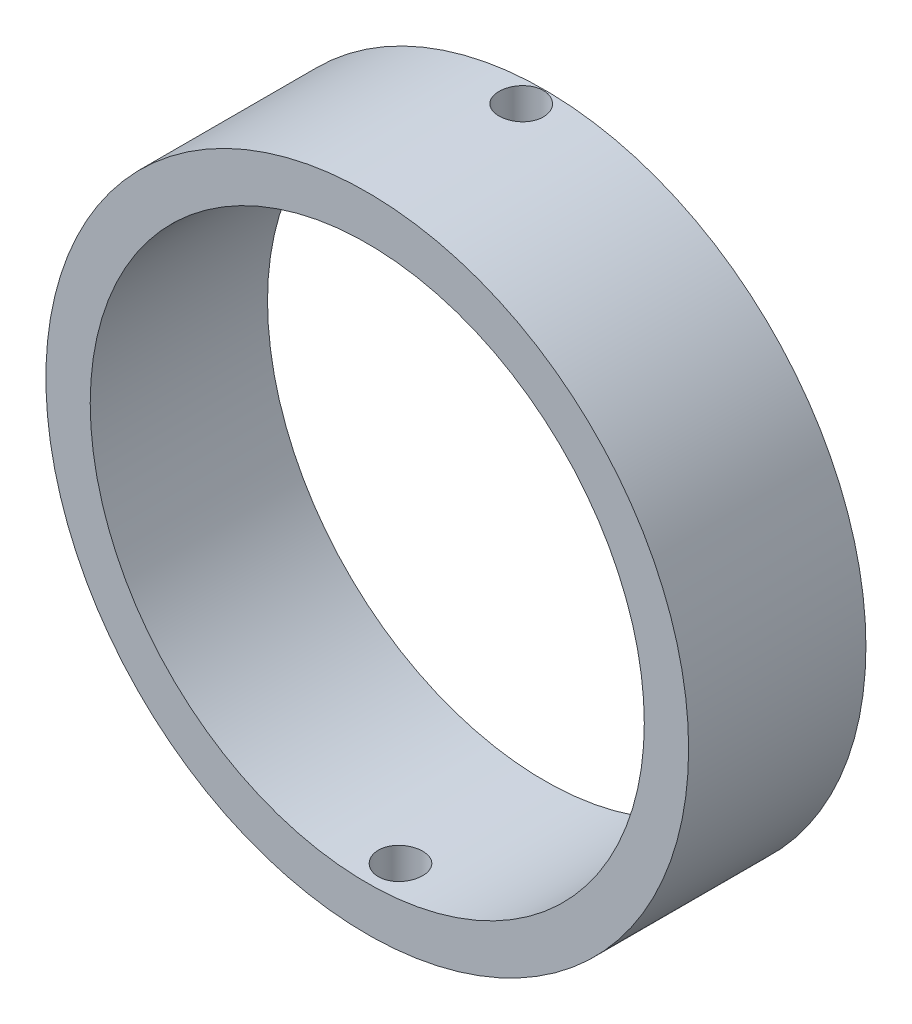
ISO-10303-21;
HEADER;
FILE_DESCRIPTION(('STEP AP214'),'2;1');
FILE_NAME('part.step','',(''),(''),'','','');
FILE_SCHEMA(('AUTOMOTIVE_DESIGN { 1 0 10303 214 1 1 1 1 }'));
ENDSEC;
DATA;
#1=APPLICATION_CONTEXT('core data for automotive mechanical design processes');
#2=APPLICATION_PROTOCOL_DEFINITION('international standard','automotive_design',2000,#1);
#3=PRODUCT_CONTEXT('',#1,'mechanical');
#4=PRODUCT('Part','Part','',(#3));
#5=PRODUCT_RELATED_PRODUCT_CATEGORY('part','',(#4));
#6=PRODUCT_DEFINITION_FORMATION('','',#4);
#7=PRODUCT_DEFINITION_CONTEXT('part definition',#1,'design');
#8=PRODUCT_DEFINITION('design','',#6,#7);
#9=PRODUCT_DEFINITION_SHAPE('','',#8);
#10=(LENGTH_UNIT() NAMED_UNIT(*) SI_UNIT(.MILLI.,.METRE.));
#11=(NAMED_UNIT(*) PLANE_ANGLE_UNIT() SI_UNIT($,.RADIAN.));
#12=(NAMED_UNIT(*) SI_UNIT($,.STERADIAN.) SOLID_ANGLE_UNIT());
#13=UNCERTAINTY_MEASURE_WITH_UNIT(LENGTH_MEASURE(1.E-05),#10,'distance_accuracy_value','');
#14=(GEOMETRIC_REPRESENTATION_CONTEXT(3) GLOBAL_UNCERTAINTY_ASSIGNED_CONTEXT((#13)) GLOBAL_UNIT_ASSIGNED_CONTEXT((#10,
#11,#12)) REPRESENTATION_CONTEXT('',''));
#15=CARTESIAN_POINT('',(0.,0.,0.));
#16=DIRECTION('',(0.,0.,1.));
#17=DIRECTION('',(1.,0.,0.));
#18=AXIS2_PLACEMENT_3D('',#15,#16,#17);
#19=CARTESIAN_POINT('',(0.,0.,16.));
#20=DIRECTION('',(0.,0.,-1.));
#21=DIRECTION('',(-1.,0.,0.));
#22=AXIS2_PLACEMENT_3D('',#19,#20,#21);
#23=CYLINDRICAL_SURFACE('',#22,29.);
#24=CARTESIAN_POINT('',(0.,29.,4.10891279559255));
#25=CARTESIAN_POINT('',(-0.11219781951482,28.9999990868251,4.10890786846932));
#26=CARTESIAN_POINT('',(-0.22447358977125,28.9993419212065,4.09943979792541));
#27=CARTESIAN_POINT('',(-0.445923190959033,28.9967835376471,4.06180666910525));
#28=CARTESIAN_POINT('',(-0.55509328626596,28.9948808825545,4.03362001118363));
#29=CARTESIAN_POINT('',(-0.767091894513714,28.9900466965074,3.95936469679368));
#30=CARTESIAN_POINT('',(-0.869923786418615,28.9871157194385,3.91330566552079));
#31=CARTESIAN_POINT('',(-1.0663705098148,28.980554273346,3.80462912367283));
#32=CARTESIAN_POINT('',(-1.15998740659419,28.9769239616008,3.74201533504087));
#33=CARTESIAN_POINT('',(-1.33554073444891,28.969364438608,3.60188436379909));
#34=CARTESIAN_POINT('',(-1.41745843221283,28.9654347630945,3.5243437355337));
#35=CARTESIAN_POINT('',(-1.56712762225839,28.9577233526317,3.35660898057448));
#36=CARTESIAN_POINT('',(-1.6348785143176,28.953941623956,3.26641431802208));
#37=CARTESIAN_POINT('',(-1.7543507491539,28.9469489134988,3.07582295908316));
#38=CARTESIAN_POINT('',(-1.80605619479745,28.943738499085,2.97541627497255));
#39=CARTESIAN_POINT('',(-1.89186816043847,28.9382565898698,2.76732094085253));
#40=CARTESIAN_POINT('',(-1.92597490355253,28.935985083165,2.65963238318238));
#41=CARTESIAN_POINT('',(-1.97556842395801,28.9326416470759,2.4402134437421));
#42=CARTESIAN_POINT('',(-1.99108499910848,28.931567798178,2.32848982666775));
#43=CARTESIAN_POINT('',(-2.00314973173091,28.9307350330865,2.1040190544217));
#44=CARTESIAN_POINT('',(-1.99969814346407,28.930976099267,1.9912719129902));
#45=CARTESIAN_POINT('',(-1.97394922086929,28.9327441979778,1.76815793218316));
#46=CARTESIAN_POINT('',(-1.95168416934708,28.9342690276286,1.65778734725841));
#47=CARTESIAN_POINT('',(-1.88899043997421,28.9384293591186,1.44235378697192));
#48=CARTESIAN_POINT('',(-1.84856163400784,28.9410648687918,1.33729084905281));
#49=CARTESIAN_POINT('',(-1.75065151248554,28.9471521076119,1.13535144642691));
#50=CARTESIAN_POINT('',(-1.69315559744967,28.9506045350483,1.03848208216548));
#51=CARTESIAN_POINT('',(-1.56275391723186,28.9579358820925,0.855757222217121));
#52=CARTESIAN_POINT('',(-1.48984793989615,28.9618148075716,0.769901878188803));
#53=CARTESIAN_POINT('',(-1.33051405834731,28.9695718335481,0.61145438425475));
#54=CARTESIAN_POINT('',(-1.24405822390941,28.9734499153934,0.538890316935819));
#55=CARTESIAN_POINT('',(-1.06017657185294,28.9807604753281,0.409301960558244));
#56=CARTESIAN_POINT('',(-0.962750749567816,28.9841929532279,0.352277678110124));
#57=CARTESIAN_POINT('',(-0.759677306657611,28.9902259018983,0.255389801419838));
#58=CARTESIAN_POINT('',(-0.654029152807338,28.9928263186529,0.215527321231924));
#59=CARTESIAN_POINT('',(-0.437517831418851,28.9969014370709,0.154113609462144));
#60=CARTESIAN_POINT('',(-0.326654738036638,28.9983761547365,0.13256211758259));
#61=CARTESIAN_POINT('',(-0.103104119226373,29.0000316457282,0.108417062507951));
#62=CARTESIAN_POINT('',(0.0095791950060323,29.0002150683856,0.105784683014217));
#63=CARTESIAN_POINT('',(0.233785705770457,28.9992743563079,0.119451081370278));
#64=CARTESIAN_POINT('',(0.34530890966944,28.9981502298812,0.135749738929566));
#65=CARTESIAN_POINT('',(0.563919746249213,28.9947226360886,0.186783403350138));
#66=CARTESIAN_POINT('',(0.671011567740033,28.9924203112876,0.221500549966667));
#67=CARTESIAN_POINT('',(0.877849115682946,28.9868952295703,0.308367532873969));
#68=CARTESIAN_POINT('',(0.977594761858643,28.9836724625977,0.360517559630579));
#69=CARTESIAN_POINT('',(1.16708599258944,28.9766617715051,0.480868413474268));
#70=CARTESIAN_POINT('',(1.25681511487271,28.972872940267,0.549095106610017));
#71=CARTESIAN_POINT('',(1.42356036874468,28.9651593638688,0.699625018811105));
#72=CARTESIAN_POINT('',(1.50057634856699,28.9612346170869,0.781928405896701));
#73=CARTESIAN_POINT('',(1.63984107272208,28.9536838278527,0.958443158418399));
#74=CARTESIAN_POINT('',(1.70206459321758,28.9500583024009,1.05267444983183));
#75=CARTESIAN_POINT('',(1.80980545132305,28.9435231104356,1.25027025987213));
#76=CARTESIAN_POINT('',(1.85532291003662,28.9406134387329,1.35363471228523));
#77=CARTESIAN_POINT('',(1.92831608887044,28.935841842411,1.56647136533227));
#78=CARTESIAN_POINT('',(1.95580756267055,28.9339790031243,1.67593814184513));
#79=CARTESIAN_POINT('',(1.99201979649604,28.9315086312462,1.89794712429031));
#80=CARTESIAN_POINT('',(2.00074079128119,28.930901082955,2.0104892917413));
#81=CARTESIAN_POINT('',(1.99916214064585,28.931010193268,2.23520365005236));
#82=CARTESIAN_POINT('',(1.9889021422839,28.9317240916666,2.34737612292635));
#83=CARTESIAN_POINT('',(1.94973508321187,28.9343897991386,2.56840133331779));
#84=CARTESIAN_POINT('',(1.92082798999882,28.9363416103697,2.6772540650484));
#85=CARTESIAN_POINT('',(1.84519658474373,28.9412625116291,2.88855479844702));
#86=CARTESIAN_POINT('',(1.79847260795681,28.9442315825158,2.99100292058648));
#87=CARTESIAN_POINT('',(1.68853880713927,28.9508524178736,3.18660617675232));
#88=CARTESIAN_POINT('',(1.62532936278373,28.9545041666215,3.27976152473131));
#89=CARTESIAN_POINT('',(1.48407119020408,28.9620878270818,3.4543367567487));
#90=CARTESIAN_POINT('',(1.40599350805653,28.9660202759209,3.53573318872811));
#91=CARTESIAN_POINT('',(1.23725968698352,28.9737174913465,3.68429368596897));
#92=CARTESIAN_POINT('',(1.14660048501396,28.977482216804,3.75145427533819));
#93=CARTESIAN_POINT('',(0.955154185160608,28.9844244746343,3.86969724004855));
#94=CARTESIAN_POINT('',(0.854352997812072,28.9876011722239,3.92075682910019));
#95=CARTESIAN_POINT('',(0.645658559454037,28.992998733571,4.00516333708204));
#96=CARTESIAN_POINT('',(0.537773737243863,28.9952207104124,4.03853089337021));
#97=CARTESIAN_POINT('',(0.357696095906008,28.9978794962247,4.07798228764514));
#98=CARTESIAN_POINT('',(0.286665728955692,28.998671127198,4.08956611359125));
#99=CARTESIAN_POINT('',(0.143767577559941,28.9997316712312,4.1050329396661));
#100=CARTESIAN_POINT('',(0.0718997945554658,29.0000005851904,4.10891595304382));
#101=CARTESIAN_POINT('',(0.,29.,4.10891279559255));
#102=B_SPLINE_CURVE_WITH_KNOTS('',3,(#24,#25,#26,#27,#28,#29,#30,#31,#32,#33,#34,#35,#36,#37,
#38,#39,#40,#41,#42,#43,#44,#45,#46,#47,#48,#49,#50,#51,#52,#53,#54,#55,#56,#57,#58,#59,#60,#61,
#62,#63,#64,#65,#66,#67,#68,#69,#70,#71,#72,#73,#74,#75,#76,#77,#78,#79,#80,#81,#82,#83,#84,#85,
#86,#87,#88,#89,#90,#91,#92,#93,#94,#95,#96,#97,#98,#99,#100,#101),.UNSPECIFIED.,.T.,.F.,(4,2,2,
2,2,2,2,2,2,2,2,2,2,2,2,2,2,2,2,2,2,2,2,2,2,2,2,2,2,2,2,2,2,2,2,2,2,2,4),(0.,0.336330971746299,
0.673050716523682,1.009589371463,1.34605242794145,1.68304834536725,2.0200585378204,
2.35740156716057,2.69474031955634,3.0315376309764,3.36833042776434,3.70454647861646,
4.04076490096252,4.37727176286104,4.71378325782602,5.05099775268415,5.38821239099094,
5.72544891620521,6.06268064739336,6.3992202829913,6.73575778018013,7.07196953483153,
7.40818496294057,7.74494507305546,8.08170920303963,8.4190435231137,8.75637539777561,
9.09341206933809,9.43044452560531,9.76677379100229,10.1031036426425,10.4394271659739,
10.7757429441573,11.1127204771052,11.4497801935829,11.7873148013694,12.1244548115798,
12.339986356492,12.5555175305894),.UNSPECIFIED.);
#103=CARTESIAN_POINT('',(0.,29.,4.10891279559255));
#104=VERTEX_POINT('',#103);
#105=EDGE_CURVE('E71',#104,#104,#102,.T.);
#106=ORIENTED_EDGE('',*,*,#105,.T.);
#107=EDGE_LOOP('',(#106));
#108=FACE_BOUND('',#107,.T.);
#109=CARTESIAN_POINT('',(0.,0.,16.));
#110=DIRECTION('',(0.,0.,1.));
#111=DIRECTION('',(1.,0.,0.));
#112=AXIS2_PLACEMENT_3D('',#109,#110,#111);
#113=CIRCLE('',#112,29.);
#114=CARTESIAN_POINT('',(29.,0.,16.));
#115=VERTEX_POINT('',#114);
#116=EDGE_CURVE('E10',#115,#115,#113,.T.);
#117=ORIENTED_EDGE('',*,*,#116,.F.);
#118=EDGE_LOOP('',(#117));
#119=FACE_BOUND('',#118,.T.);
#120=CARTESIAN_POINT('',(0.,0.,0.));
#121=DIRECTION('',(0.,0.,1.));
#122=DIRECTION('',(1.,0.,0.));
#123=AXIS2_PLACEMENT_3D('',#120,#121,#122);
#124=CIRCLE('',#123,29.);
#125=CARTESIAN_POINT('',(29.,0.,0.));
#126=VERTEX_POINT('',#125);
#127=EDGE_CURVE('E53',#126,#126,#124,.T.);
#128=ORIENTED_EDGE('',*,*,#127,.T.);
#129=EDGE_LOOP('',(#128));
#130=FACE_BOUND('',#129,.T.);
#131=CARTESIAN_POINT('',(0.,-29.,11.));
#132=CARTESIAN_POINT('',(0.11219781951482,-28.9999990868251,11.0000049271232));
#133=CARTESIAN_POINT('',(0.22447358977125,-28.9993419212065,11.0094729976671));
#134=CARTESIAN_POINT('',(0.445923190959034,-28.9967835376471,11.0471061264873));
#135=CARTESIAN_POINT('',(0.55509328626596,-28.9948808825545,11.0752927844089));
#136=CARTESIAN_POINT('',(0.767091894513714,-28.9900466965074,11.1495480987989));
#137=CARTESIAN_POINT('',(0.869923786418615,-28.9871157194385,11.1956071300718));
#138=CARTESIAN_POINT('',(1.0663705098148,-28.980554273346,11.3042836719197));
#139=CARTESIAN_POINT('',(1.1599874065942,-28.9769239616008,11.3668974605517));
#140=CARTESIAN_POINT('',(1.33554073444891,-28.969364438608,11.5070284317935));
#141=CARTESIAN_POINT('',(1.41745843221283,-28.9654347630945,11.5845690600588));
#142=CARTESIAN_POINT('',(1.56712762225839,-28.9577233526317,11.7523038150181));
#143=CARTESIAN_POINT('',(1.6348785143176,-28.953941623956,11.8424984775705));
#144=CARTESIAN_POINT('',(1.7543507491539,-28.9469489134988,12.0330898365094));
#145=CARTESIAN_POINT('',(1.80605619479745,-28.943738499085,12.13349652062));
#146=CARTESIAN_POINT('',(1.89186816043847,-28.9382565898698,12.34159185474));
#147=CARTESIAN_POINT('',(1.92597490355253,-28.935985083165,12.4492804124102));
#148=CARTESIAN_POINT('',(1.97556842395801,-28.9326416470759,12.6686993518504));
#149=CARTESIAN_POINT('',(1.99108499910848,-28.931567798178,12.7804229689248));
#150=CARTESIAN_POINT('',(2.00314973173092,-28.9307350330865,13.0048937411708));
#151=CARTESIAN_POINT('',(1.99969814346408,-28.930976099267,13.1176408826023));
#152=CARTESIAN_POINT('',(1.97394922086929,-28.9327441979778,13.3407548634094));
#153=CARTESIAN_POINT('',(1.95168416934708,-28.9342690276286,13.4511254483341));
#154=CARTESIAN_POINT('',(1.88899043997421,-28.9384293591186,13.6665590086206));
#155=CARTESIAN_POINT('',(1.84856163400784,-28.9410648687918,13.7716219465397));
#156=CARTESIAN_POINT('',(1.75065151248554,-28.9471521076119,13.9735613491656));
#157=CARTESIAN_POINT('',(1.69315559744967,-28.9506045350483,14.0704307134271));
#158=CARTESIAN_POINT('',(1.56275391723186,-28.9579358820925,14.2531555733754));
#159=CARTESIAN_POINT('',(1.48984793989616,-28.9618148075716,14.3390109174037));
#160=CARTESIAN_POINT('',(1.33051405834731,-28.9695718335481,14.4974584113378));
#161=CARTESIAN_POINT('',(1.24405822390941,-28.9734499153934,14.5700224786567));
#162=CARTESIAN_POINT('',(1.06017657185294,-28.9807604753281,14.6996108350343));
#163=CARTESIAN_POINT('',(0.962750749567819,-28.9841929532279,14.7566351174824));
#164=CARTESIAN_POINT('',(0.759677306657614,-28.9902259018983,14.8535229941727));
#165=CARTESIAN_POINT('',(0.65402915280734,-28.9928263186529,14.8933854743606));
#166=CARTESIAN_POINT('',(0.437517831418854,-28.9969014370709,14.9547991861304));
#167=CARTESIAN_POINT('',(0.326654738036641,-28.9983761547365,14.97635067801));
#168=CARTESIAN_POINT('',(0.103104119226376,-29.0000316457282,15.0004957330846));
#169=CARTESIAN_POINT('',(-0.00957919500602985,-29.0002150683856,15.0031281125783));
#170=CARTESIAN_POINT('',(-0.233785705770455,-28.9992743563079,14.9894617142223));
#171=CARTESIAN_POINT('',(-0.345308909669437,-28.9981502298812,14.973163056663));
#172=CARTESIAN_POINT('',(-0.56391974624921,-28.9947226360886,14.9221293922424));
#173=CARTESIAN_POINT('',(-0.671011567740031,-28.9924203112876,14.8874122456259));
#174=CARTESIAN_POINT('',(-0.877849115682943,-28.9868952295703,14.8005452627186));
#175=CARTESIAN_POINT('',(-0.97759476185864,-28.9836724625977,14.748395235962));
#176=CARTESIAN_POINT('',(-1.16708599258944,-28.9766617715051,14.6280443821183));
#177=CARTESIAN_POINT('',(-1.25681511487271,-28.972872940267,14.5598176889825));
#178=CARTESIAN_POINT('',(-1.42356036874467,-28.9651593638688,14.4092877767814));
#179=CARTESIAN_POINT('',(-1.50057634856698,-28.9612346170869,14.3269843896958));
#180=CARTESIAN_POINT('',(-1.63984107272208,-28.9536838278527,14.1504696371741));
#181=CARTESIAN_POINT('',(-1.70206459321757,-28.9500583024009,14.0562383457607));
#182=CARTESIAN_POINT('',(-1.80980545132305,-28.9435231104356,13.8586425357204));
#183=CARTESIAN_POINT('',(-1.85532291003662,-28.9406134387329,13.7552780833073));
#184=CARTESIAN_POINT('',(-1.92831608887043,-28.935841842411,13.5424414302603));
#185=CARTESIAN_POINT('',(-1.95580756267055,-28.9339790031243,13.4329746537474));
#186=CARTESIAN_POINT('',(-1.99201979649604,-28.9315086312462,13.2109656713022));
#187=CARTESIAN_POINT('',(-2.00074079128119,-28.930901082955,13.0984235038512));
#188=CARTESIAN_POINT('',(-1.99916214064585,-28.931010193268,12.8737091455402));
#189=CARTESIAN_POINT('',(-1.9889021422839,-28.9317240916666,12.7615366726662));
#190=CARTESIAN_POINT('',(-1.94973508321187,-28.9343897991386,12.5405114622748));
#191=CARTESIAN_POINT('',(-1.92082798999882,-28.9363416103697,12.4316587305441));
#192=CARTESIAN_POINT('',(-1.84519658474373,-28.9412625116291,12.2203579971455));
#193=CARTESIAN_POINT('',(-1.79847260795681,-28.9442315825158,12.1179098750061));
#194=CARTESIAN_POINT('',(-1.68853880713927,-28.9508524178736,11.9223066188402));
#195=CARTESIAN_POINT('',(-1.62532936278373,-28.9545041666215,11.8291512708612));
#196=CARTESIAN_POINT('',(-1.48407119020408,-28.9620878270818,11.6545760388438));
#197=CARTESIAN_POINT('',(-1.40599350805653,-28.9660202759209,11.5731796068644));
#198=CARTESIAN_POINT('',(-1.23725968698352,-28.9737174913465,11.4246191096236));
#199=CARTESIAN_POINT('',(-1.14660048501396,-28.977482216804,11.3574585202544));
#200=CARTESIAN_POINT('',(-0.955154185160606,-28.9844244746343,11.239215555544));
#201=CARTESIAN_POINT('',(-0.854352997812071,-28.9876011722239,11.1881559664924));
#202=CARTESIAN_POINT('',(-0.645658559454037,-28.992998733571,11.1037494585105));
#203=CARTESIAN_POINT('',(-0.537773737243863,-28.9952207104124,11.0703819022223));
#204=CARTESIAN_POINT('',(-0.357696095906008,-28.9978794962247,11.0309305079474));
#205=CARTESIAN_POINT('',(-0.286665728955692,-28.998671127198,11.0193466820013));
#206=CARTESIAN_POINT('',(-0.143767577559942,-28.9997316712312,11.0038798559264));
#207=CARTESIAN_POINT('',(-0.071899794555466,-29.0000005851904,10.9999968425487));
#208=CARTESIAN_POINT('',(0.,-29.,11.));
#209=B_SPLINE_CURVE_WITH_KNOTS('',3,(#131,#132,#133,#134,#135,#136,#137,#138,#139,#140,#141,
#142,#143,#144,#145,#146,#147,#148,#149,#150,#151,#152,#153,#154,#155,#156,#157,#158,#159,#160,
#161,#162,#163,#164,#165,#166,#167,#168,#169,#170,#171,#172,#173,#174,#175,#176,#177,#178,#179,
#180,#181,#182,#183,#184,#185,#186,#187,#188,#189,#190,#191,#192,#193,#194,#195,#196,#197,#198,
#199,#200,#201,#202,#203,#204,#205,#206,#207,#208),.UNSPECIFIED.,.T.,.F.,(4,2,2,2,2,2,2,2,2,2,2,
2,2,2,2,2,2,2,2,2,2,2,2,2,2,2,2,2,2,2,2,2,2,2,2,2,2,2,4),(0.,0.336330971746299,
0.673050716523682,1.009589371463,1.34605242794145,1.68304834536725,2.0200585378204,
2.35740156716056,2.69474031955634,3.0315376309764,3.36833042776434,3.70454647861647,
4.04076490096252,4.37727176286104,4.71378325782602,5.05099775268415,5.38821239099094,
5.72544891620521,6.06268064739336,6.39922028299131,6.73575778018013,7.07196953483153,
7.40818496294057,7.74494507305547,8.08170920303963,8.4190435231137,8.75637539777561,
9.09341206933809,9.43044452560531,9.76677379100229,10.1031036426425,10.4394271659739,
10.7757429441573,11.1127204771052,11.4497801935829,11.7873148013694,12.1244548115798,
12.339986356492,12.5555175305894),.UNSPECIFIED.);
#210=CARTESIAN_POINT('',(0.,-29.,11.));
#211=VERTEX_POINT('',#210);
#212=EDGE_CURVE('E72',#211,#211,#209,.T.);
#213=ORIENTED_EDGE('',*,*,#212,.F.);
#214=EDGE_LOOP('',(#213));
#215=FACE_BOUND('',#214,.T.);
#216=ADVANCED_FACE('F39',(#108,#119,#130,#215),#23,.T.);
#217=CARTESIAN_POINT('',(0.,0.,16.));
#218=DIRECTION('',(0.,0.,-1.));
#219=DIRECTION('',(-1.,0.,0.));
#220=AXIS2_PLACEMENT_3D('',#217,#218,#219);
#221=CYLINDRICAL_SURFACE('',#220,25.);
#222=CARTESIAN_POINT('',(0.,0.,0.));
#223=DIRECTION('',(0.,0.,1.));
#224=DIRECTION('',(1.,0.,0.));
#225=AXIS2_PLACEMENT_3D('',#222,#223,#224);
#226=CIRCLE('',#225,25.);
#227=CARTESIAN_POINT('',(25.,0.,0.));
#228=VERTEX_POINT('',#227);
#229=EDGE_CURVE('E62',#228,#228,#226,.T.);
#230=ORIENTED_EDGE('',*,*,#229,.F.);
#231=EDGE_LOOP('',(#230));
#232=FACE_BOUND('',#231,.T.);
#233=CARTESIAN_POINT('',(0.,0.,16.));
#234=DIRECTION('',(0.,0.,1.));
#235=DIRECTION('',(1.,0.,0.));
#236=AXIS2_PLACEMENT_3D('',#233,#234,#235);
#237=CIRCLE('',#236,25.);
#238=CARTESIAN_POINT('',(25.,0.,16.));
#239=VERTEX_POINT('',#238);
#240=EDGE_CURVE('E59',#239,#239,#237,.T.);
#241=ORIENTED_EDGE('',*,*,#240,.T.);
#242=EDGE_LOOP('',(#241));
#243=FACE_BOUND('',#242,.T.);
#244=CARTESIAN_POINT('',(0.,25.,4.10891279559255));
#245=CARTESIAN_POINT('',(-0.112148501200591,24.999998949073,4.10890789034686));
#246=CARTESIAN_POINT('',(-0.224373739326827,24.9992373134395,4.09944810683453));
#247=CARTESIAN_POINT('',(-0.445720290379944,24.9962722256398,4.06184981693353));
#248=CARTESIAN_POINT('',(-0.554837921872683,24.9940671320308,4.03369004513522));
#249=CARTESIAN_POINT('',(-0.766731360013592,24.9884643628279,3.95951031458434));
#250=CARTESIAN_POINT('',(-0.869510674462733,24.985067353965,3.91350033932278));
#251=CARTESIAN_POINT('',(-1.06586256805421,24.9774619095379,3.80494382744582));
#252=CARTESIAN_POINT('',(-1.15943713538756,24.9732536497846,3.74240087270136));
#253=CARTESIAN_POINT('',(-1.33496920072919,24.9644869591086,3.60239403114));
#254=CARTESIAN_POINT('',(-1.41690198846921,24.959927814105,3.5248992060949));
#255=CARTESIAN_POINT('',(-1.56661280132687,24.9509792054497,3.35725359831247));
#256=CARTESIAN_POINT('',(-1.63439021021993,24.9465897491919,3.26710226488629));
#257=CARTESIAN_POINT('',(-1.75394898822317,24.9384697127319,3.07655433976294));
#258=CARTESIAN_POINT('',(-1.80570879574547,24.9347400235207,2.97614417808402));
#259=CARTESIAN_POINT('',(-1.89162534239648,24.9283697901071,2.76802353430002));
#260=CARTESIAN_POINT('',(-1.92578237053956,24.9257292280228,2.66031317208744));
#261=CARTESIAN_POINT('',(-1.97545249059463,24.9218420922796,2.44089603757098));
#262=CARTESIAN_POINT('',(-1.99100564840092,24.9205925233374,2.32919838903655));
#263=CARTESIAN_POINT('',(-2.00315029069458,24.9196193377388,2.10477144611936));
#264=CARTESIAN_POINT('',(-1.99974210571233,24.9198956944828,1.99204216975394));
#265=CARTESIAN_POINT('',(-1.97409394178041,24.9219404182362,1.76902622864835));
#266=CARTESIAN_POINT('',(-1.95189747196019,24.9237053380592,1.6587345240808));
#267=CARTESIAN_POINT('',(-1.88937039129967,24.9285229092414,1.44344721591654));
#268=CARTESIAN_POINT('',(-1.84903961554254,24.9315755723115,1.33845166049368));
#269=CARTESIAN_POINT('',(-1.75133992873298,24.9386286293221,1.13659822675313));
#270=CARTESIAN_POINT('',(-1.69395145831963,24.9426301101621,1.03974985493829));
#271=CARTESIAN_POINT('',(-1.56377954162011,24.9511289058012,0.857043911378762));
#272=CARTESIAN_POINT('',(-1.4909958083568,24.9556262298424,0.771186544561041));
#273=CARTESIAN_POINT('',(-1.33185521595092,24.9646252925535,0.612646775553927));
#274=CARTESIAN_POINT('',(-1.2454607355265,24.9691270080293,0.540002130542538));
#275=CARTESIAN_POINT('',(-1.06168243420356,24.9776155324033,0.410241725724791));
#276=CARTESIAN_POINT('',(-0.964298606696088,24.9816023409919,0.353125975257537));
#277=CARTESIAN_POINT('',(-0.761281730842601,24.9886125124235,0.256047166778157));
#278=CARTESIAN_POINT('',(-0.655647900243696,24.9916357837669,0.216085737652469));
#279=CARTESIAN_POINT('',(-0.439140652076438,24.9963771596136,0.154476147243432));
#280=CARTESIAN_POINT('',(-0.328267334761342,24.9980952890789,0.132827635707194));
#281=CARTESIAN_POINT('',(-0.104755728692554,25.0000295871275,0.108505641647162));
#282=CARTESIAN_POINT('',(0.00787684978658222,25.0002498844962,0.105779997659366));
#283=CARTESIAN_POINT('',(0.231997398289427,24.9991747156446,0.119244528469657));
#284=CARTESIAN_POINT('',(0.343485378132655,24.997879262439,0.13543454085315));
#285=CARTESIAN_POINT('',(0.562003586070353,24.993920962569,0.186227584015276));
#286=CARTESIAN_POINT('',(0.669039459064206,24.9912599082841,0.220806481155917));
#287=CARTESIAN_POINT('',(0.875789844289443,24.9848694178908,0.307371101951206));
#288=CARTESIAN_POINT('',(0.975504249553137,24.9811399661768,0.359357079864115));
#289=CARTESIAN_POINT('',(1.16501881901419,24.9730206322487,0.479391558646074));
#290=CARTESIAN_POINT('',(1.25479700258439,24.9686293346377,0.547474666075205));
#291=CARTESIAN_POINT('',(1.42166888372575,24.9596845800892,0.697720716114817));
#292=CARTESIAN_POINT('',(1.49876237813364,24.9551311205557,0.779883884194382));
#293=CARTESIAN_POINT('',(1.63825500557917,24.9463630657613,0.956183862552826));
#294=CARTESIAN_POINT('',(1.70062013542298,24.9421492691548,1.05034762215373));
#295=CARTESIAN_POINT('',(1.80865267114119,24.9345487408724,1.2478414489798));
#296=CARTESIAN_POINT('',(1.85432023248381,24.9311620014959,1.3511714308487));
#297=CARTESIAN_POINT('',(1.92760320130322,24.9256033881724,1.56394346392823));
#298=CARTESIAN_POINT('',(1.95523952863507,24.923430106794,1.67337827165399));
#299=CARTESIAN_POINT('',(1.9917436854258,24.9205396742121,1.89535294431322));
#300=CARTESIAN_POINT('',(2.00061184390729,24.9198224974817,2.00789275477821));
#301=CARTESIAN_POINT('',(1.99932425467037,24.9199258085731,2.23254490303971));
#302=CARTESIAN_POINT('',(1.98922193761991,24.9207419777031,2.34465755293808));
#303=CARTESIAN_POINT('',(1.95039146589907,24.9238108465426,2.56558859745525));
#304=CARTESIAN_POINT('',(1.92166328170984,24.9260635485287,2.67440698685291));
#305=CARTESIAN_POINT('',(1.84640985807629,24.9317505312538,2.88566478637718));
#306=CARTESIAN_POINT('',(1.79988546287813,24.935184755941,2.98810449883801));
#307=CARTESIAN_POINT('',(1.69036641767628,24.9428479020433,3.18372769680977));
#308=CARTESIAN_POINT('',(1.62737205611018,24.9470768095409,3.27691134438221));
#309=CARTESIAN_POINT('',(1.48650072310877,24.9558669540846,3.45165047505191));
#310=CARTESIAN_POINT('',(1.40858428696511,24.9604290520764,3.53317409890004));
#311=CARTESIAN_POINT('',(1.24015015364579,24.9693637159291,3.68201798021316));
#312=CARTESIAN_POINT('',(1.14962940609983,24.9737362355732,3.74933478953532));
#313=CARTESIAN_POINT('',(0.958394773734128,24.9818063404304,3.86793694972633));
#314=CARTESIAN_POINT('',(0.857663353829782,24.9855027329123,3.9191940816903));
#315=CARTESIAN_POINT('',(0.649063926404823,24.9917898409119,4.00400233457237));
#316=CARTESIAN_POINT('',(0.54120431265145,24.9943818310311,4.03757387724355));
#317=CARTESIAN_POINT('',(0.360586728453429,24.9975001950565,4.07747642638765));
#318=CARTESIAN_POINT('',(0.288991461128519,24.9984333726036,4.08924947271548));
#319=CARTESIAN_POINT('',(0.144941480449219,24.9996836139632,4.10496923311684));
#320=CARTESIAN_POINT('',(0.0724867691696071,25.0000006792628,4.10891596607997));
#321=CARTESIAN_POINT('',(0.,25.,4.10891279559255));
#322=B_SPLINE_CURVE_WITH_KNOTS('',3,(#244,#245,#246,#247,#248,#249,#250,#251,#252,#253,#254,
#255,#256,#257,#258,#259,#260,#261,#262,#263,#264,#265,#266,#267,#268,#269,#270,#271,#272,#273,
#274,#275,#276,#277,#278,#279,#280,#281,#282,#283,#284,#285,#286,#287,#288,#289,#290,#291,#292,
#293,#294,#295,#296,#297,#298,#299,#300,#301,#302,#303,#304,#305,#306,#307,#308,#309,#310,#311,
#312,#313,#314,#315,#316,#317,#318,#319,#320,#321),.UNSPECIFIED.,.T.,.F.,(4,2,2,2,2,2,2,2,2,2,2,
2,2,2,2,2,2,2,2,2,2,2,2,2,2,2,2,2,2,2,2,2,2,2,2,2,2,2,4),(0.,0.336180854244424,
0.672744665631024,1.0091205100243,1.34542353821397,1.68243005166542,2.01945123292863,
2.3569241307669,2.69439148756954,3.03113074767167,3.36786413781999,3.70381986144993,
4.03977864038674,4.37612414549697,4.71247592084615,5.04977426292956,5.38707280786433,
5.72440337385941,6.06172748792369,6.39812138722484,6.73451239818437,7.07046301396936,
7.40641853706458,7.74310299204603,8.07979283898085,8.41725256048852,8.75470913988618,
9.0917735023239,9.42883195567598,9.76494250175879,10.1010535805213,10.4371487162665,
10.7732379663908,11.1102286696942,11.4473010703487,11.7849624710837,12.122233110921,
12.3395228877475,12.5568121401225),.UNSPECIFIED.);
#323=CARTESIAN_POINT('',(0.,25.,4.10891279559255));
#324=VERTEX_POINT('',#323);
#325=EDGE_CURVE('E64',#324,#324,#322,.T.);
#326=ORIENTED_EDGE('',*,*,#325,.F.);
#327=EDGE_LOOP('',(#326));
#328=FACE_BOUND('',#327,.T.);
#329=CARTESIAN_POINT('',(0.,-25.,11.));
#330=CARTESIAN_POINT('',(0.112148501200592,-24.999998949073,11.0000049052457));
#331=CARTESIAN_POINT('',(0.224373739326829,-24.9992373134395,11.009464688758));
#332=CARTESIAN_POINT('',(0.445720290379945,-24.9962722256398,11.047062978659));
#333=CARTESIAN_POINT('',(0.554837921872684,-24.9940671320308,11.0752227504573));
#334=CARTESIAN_POINT('',(0.766731360013594,-24.9884643628279,11.1494024810082));
#335=CARTESIAN_POINT('',(0.869510674462734,-24.985067353965,11.1954124562698));
#336=CARTESIAN_POINT('',(1.06586256805421,-24.9774619095379,11.3039689681467));
#337=CARTESIAN_POINT('',(1.15943713538757,-24.9732536497846,11.3665119228912));
#338=CARTESIAN_POINT('',(1.33496920072919,-24.9644869591086,11.5065187644525));
#339=CARTESIAN_POINT('',(1.41690198846921,-24.959927814105,11.5840135894976));
#340=CARTESIAN_POINT('',(1.56661280132687,-24.9509792054497,11.7516591972801));
#341=CARTESIAN_POINT('',(1.63439021021993,-24.9465897491919,11.8418105307063));
#342=CARTESIAN_POINT('',(1.75394898822317,-24.9384697127319,12.0323584558296));
#343=CARTESIAN_POINT('',(1.80570879574548,-24.9347400235207,12.1327686175085));
#344=CARTESIAN_POINT('',(1.89162534239648,-24.9283697901071,12.3408892612925));
#345=CARTESIAN_POINT('',(1.92578237053956,-24.9257292280228,12.4485996235051));
#346=CARTESIAN_POINT('',(1.97545249059463,-24.9218420922796,12.6680167580216));
#347=CARTESIAN_POINT('',(1.99100564840092,-24.9205925233374,12.779714406556));
#348=CARTESIAN_POINT('',(2.00315029069459,-24.9196193377388,13.0041413494732));
#349=CARTESIAN_POINT('',(1.99974210571234,-24.9198956944828,13.1168706258386));
#350=CARTESIAN_POINT('',(1.97409394178041,-24.9219404182362,13.3398865669442));
#351=CARTESIAN_POINT('',(1.9518974719602,-24.9237053380592,13.4501782715117));
#352=CARTESIAN_POINT('',(1.88937039129967,-24.9285229092414,13.665465579676));
#353=CARTESIAN_POINT('',(1.84903961554254,-24.9315755723115,13.7704611350989));
#354=CARTESIAN_POINT('',(1.75133992873298,-24.9386286293221,13.9723145688394));
#355=CARTESIAN_POINT('',(1.69395145831964,-24.9426301101621,14.0691629406543));
#356=CARTESIAN_POINT('',(1.56377954162012,-24.9511289058012,14.2518688842138));
#357=CARTESIAN_POINT('',(1.49099580835681,-24.9556262298424,14.3377262510315));
#358=CARTESIAN_POINT('',(1.33185521595093,-24.9646252925535,14.4962660200386));
#359=CARTESIAN_POINT('',(1.2454607355265,-24.9691270080293,14.56891066505));
#360=CARTESIAN_POINT('',(1.06168243420357,-24.9776155324033,14.6986710698678));
#361=CARTESIAN_POINT('',(0.964298606696092,-24.9816023409919,14.755786820335));
#362=CARTESIAN_POINT('',(0.761281730842605,-24.9886125124235,14.8528656288144));
#363=CARTESIAN_POINT('',(0.655647900243701,-24.9916357837669,14.8928270579401));
#364=CARTESIAN_POINT('',(0.439140652076442,-24.9963771596136,14.9544366483491));
#365=CARTESIAN_POINT('',(0.328267334761345,-24.9980952890789,14.9760851598854));
#366=CARTESIAN_POINT('',(0.104755728692558,-25.0000295871275,15.0004071539454));
#367=CARTESIAN_POINT('',(-0.00787684978657854,-25.0002498844962,15.0031327979332));
#368=CARTESIAN_POINT('',(-0.231997398289423,-24.9991747156446,14.9896682671229));
#369=CARTESIAN_POINT('',(-0.343485378132652,-24.997879262439,14.9734782547394));
#370=CARTESIAN_POINT('',(-0.56200358607035,-24.993920962569,14.9226852115773));
#371=CARTESIAN_POINT('',(-0.669039459064202,-24.9912599082841,14.8881063144366));
#372=CARTESIAN_POINT('',(-0.875789844289439,-24.9848694178908,14.8015416936413));
#373=CARTESIAN_POINT('',(-0.975504249553134,-24.9811399661768,14.7495557157284));
#374=CARTESIAN_POINT('',(-1.16501881901419,-24.9730206322487,14.6295212369465));
#375=CARTESIAN_POINT('',(-1.25479700258439,-24.9686293346377,14.5614381295173));
#376=CARTESIAN_POINT('',(-1.42166888372574,-24.9596845800892,14.4111920794777));
#377=CARTESIAN_POINT('',(-1.49876237813364,-24.9551311205557,14.3290289113982));
#378=CARTESIAN_POINT('',(-1.63825500557917,-24.9463630657613,14.1527289330397));
#379=CARTESIAN_POINT('',(-1.70062013542297,-24.9421492691548,14.0585651734388));
#380=CARTESIAN_POINT('',(-1.80865267114118,-24.9345487408724,13.8610713466127));
#381=CARTESIAN_POINT('',(-1.85432023248381,-24.9311620014959,13.7577413647438));
#382=CARTESIAN_POINT('',(-1.92760320130321,-24.9256033881724,13.5449693316643));
#383=CARTESIAN_POINT('',(-1.95523952863507,-24.923430106794,13.4355345239386));
#384=CARTESIAN_POINT('',(-1.9917436854258,-24.9205396742121,13.2135598512793));
#385=CARTESIAN_POINT('',(-2.00061184390729,-24.9198224974817,13.1010200408143));
#386=CARTESIAN_POINT('',(-1.99932425467037,-24.9199258085731,12.8763678925528));
#387=CARTESIAN_POINT('',(-1.98922193761991,-24.9207419777031,12.7642552426545));
#388=CARTESIAN_POINT('',(-1.95039146589907,-24.9238108465426,12.5433241981373));
#389=CARTESIAN_POINT('',(-1.92166328170984,-24.9260635485287,12.4345058087396));
#390=CARTESIAN_POINT('',(-1.84640985807629,-24.9317505312538,12.2232480092154));
#391=CARTESIAN_POINT('',(-1.79988546287813,-24.935184755941,12.1208082967545));
#392=CARTESIAN_POINT('',(-1.69036641767628,-24.9428479020433,11.9251850987828));
#393=CARTESIAN_POINT('',(-1.62737205611018,-24.9470768095409,11.8320014512103));
#394=CARTESIAN_POINT('',(-1.48650072310877,-24.9558669540846,11.6572623205406));
#395=CARTESIAN_POINT('',(-1.40858428696511,-24.9604290520764,11.5757386966925));
#396=CARTESIAN_POINT('',(-1.24015015364579,-24.9693637159291,11.4268948153794));
#397=CARTESIAN_POINT('',(-1.14962940609983,-24.9737362355732,11.3595780060572));
#398=CARTESIAN_POINT('',(-0.958394773734129,-24.9818063404304,11.2409758458662));
#399=CARTESIAN_POINT('',(-0.857663353829782,-24.9855027329123,11.1897187139022));
#400=CARTESIAN_POINT('',(-0.649063926404823,-24.9917898409119,11.1049104610202));
#401=CARTESIAN_POINT('',(-0.54120431265145,-24.9943818310311,11.071338918349));
#402=CARTESIAN_POINT('',(-0.360586728453429,-24.9975001950565,11.0314363692049));
#403=CARTESIAN_POINT('',(-0.288991461128518,-24.9984333726036,11.0196633228771));
#404=CARTESIAN_POINT('',(-0.144941480449217,-24.9996836139632,11.0039435624757));
#405=CARTESIAN_POINT('',(-0.0724867691696055,-25.0000006792628,10.9999968295126));
#406=CARTESIAN_POINT('',(0.,-25.,11.));
#407=B_SPLINE_CURVE_WITH_KNOTS('',3,(#329,#330,#331,#332,#333,#334,#335,#336,#337,#338,#339,
#340,#341,#342,#343,#344,#345,#346,#347,#348,#349,#350,#351,#352,#353,#354,#355,#356,#357,#358,
#359,#360,#361,#362,#363,#364,#365,#366,#367,#368,#369,#370,#371,#372,#373,#374,#375,#376,#377,
#378,#379,#380,#381,#382,#383,#384,#385,#386,#387,#388,#389,#390,#391,#392,#393,#394,#395,#396,
#397,#398,#399,#400,#401,#402,#403,#404,#405,#406),.UNSPECIFIED.,.T.,.F.,(4,2,2,2,2,2,2,2,2,2,2,
2,2,2,2,2,2,2,2,2,2,2,2,2,2,2,2,2,2,2,2,2,2,2,2,2,2,2,4),(0.,0.336180854244424,
0.672744665631024,1.0091205100243,1.34542353821397,1.68243005166542,2.01945123292863,
2.3569241307669,2.69439148756954,3.03113074767167,3.36786413781999,3.70381986144993,
4.03977864038674,4.37612414549697,4.71247592084614,5.04977426292956,5.38707280786433,
5.72440337385941,6.06172748792369,6.39812138722484,6.73451239818437,7.07046301396936,
7.40641853706458,7.74310299204603,8.07979283898084,8.41725256048853,8.75470913988618,
9.0917735023239,9.42883195567598,9.76494250175879,10.1010535805213,10.4371487162665,
10.7732379663908,11.1102286696942,11.4473010703487,11.7849624710837,12.122233110921,
12.3395228877475,12.5568121401225),.UNSPECIFIED.);
#408=CARTESIAN_POINT('',(0.,-25.,11.));
#409=VERTEX_POINT('',#408);
#410=EDGE_CURVE('E43',#409,#409,#407,.T.);
#411=ORIENTED_EDGE('',*,*,#410,.T.);
#412=EDGE_LOOP('',(#411));
#413=FACE_BOUND('',#412,.T.);
#414=ADVANCED_FACE('F73',(#232,#243,#328,#413),#221,.F.);
#415=CARTESIAN_POINT('',(0.,0.,16.));
#416=DIRECTION('',(0.,0.,1.));
#417=DIRECTION('',(1.,0.,0.));
#418=AXIS2_PLACEMENT_3D('',#415,#416,#417);
#419=PLANE('',#418);
#420=ORIENTED_EDGE('',*,*,#116,.T.);
#421=EDGE_LOOP('',(#420));
#422=FACE_BOUND('',#421,.T.);
#423=ORIENTED_EDGE('',*,*,#240,.F.);
#424=EDGE_LOOP('',(#423));
#425=FACE_BOUND('',#424,.T.);
#426=ADVANCED_FACE('F104',(#422,#425),#419,.T.);
#427=CARTESIAN_POINT('',(0.,0.,0.));
#428=DIRECTION('',(0.,0.,1.));
#429=DIRECTION('',(1.,0.,0.));
#430=AXIS2_PLACEMENT_3D('',#427,#428,#429);
#431=PLANE('',#430);
#432=ORIENTED_EDGE('',*,*,#127,.F.);
#433=EDGE_LOOP('',(#432));
#434=FACE_BOUND('',#433,.T.);
#435=ORIENTED_EDGE('',*,*,#229,.T.);
#436=EDGE_LOOP('',(#435));
#437=FACE_BOUND('',#436,.T.);
#438=ADVANCED_FACE('F80',(#434,#437),#431,.F.);
#439=CARTESIAN_POINT('',(0.,13.,2.10891279559255));
#440=DIRECTION('',(0.,1.,0.));
#441=DIRECTION('',(0.,0.,1.));
#442=AXIS2_PLACEMENT_3D('',#439,#440,#441);
#443=CYLINDRICAL_SURFACE('',#442,2.);
#444=ORIENTED_EDGE('',*,*,#325,.T.);
#445=EDGE_LOOP('',(#444));
#446=FACE_BOUND('',#445,.T.);
#447=ORIENTED_EDGE('',*,*,#105,.F.);
#448=EDGE_LOOP('',(#447));
#449=FACE_BOUND('',#448,.T.);
#450=ADVANCED_FACE('F76',(#446,#449),#443,.F.);
#451=CARTESIAN_POINT('',(0.,-13.,13.));
#452=DIRECTION('',(0.,-1.,0.));
#453=DIRECTION('',(0.,0.,-1.));
#454=AXIS2_PLACEMENT_3D('',#451,#452,#453);
#455=CYLINDRICAL_SURFACE('',#454,2.);
#456=ORIENTED_EDGE('',*,*,#410,.F.);
#457=EDGE_LOOP('',(#456));
#458=FACE_BOUND('',#457,.T.);
#459=ORIENTED_EDGE('',*,*,#212,.T.);
#460=EDGE_LOOP('',(#459));
#461=FACE_BOUND('',#460,.T.);
#462=ADVANCED_FACE('F79',(#458,#461),#455,.F.);
#463=CLOSED_SHELL('',(#216,#414,#426,#438,#450,#462));
#464=MANIFOLD_SOLID_BREP('B2',#463);
#465=ADVANCED_BREP_SHAPE_REPRESENTATION('',(#18,#464),#14);
#466=SHAPE_DEFINITION_REPRESENTATION(#9,#465);
ENDSEC;
END-ISO-10303-21;
